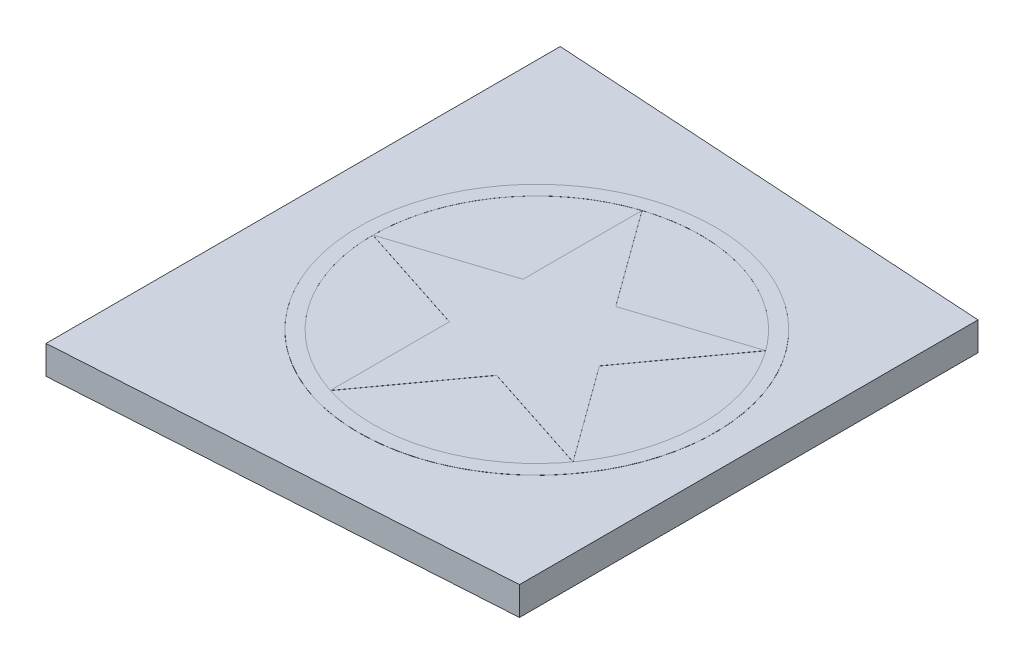
ISO-10303-21;
HEADER;
FILE_DESCRIPTION(('STEP AP214'),'2;1');
FILE_NAME('part.step','',(''),(''),'','','');
FILE_SCHEMA(('AUTOMOTIVE_DESIGN { 1 0 10303 214 1 1 1 1 }'));
ENDSEC;
DATA;
#1=APPLICATION_CONTEXT('core data for automotive mechanical design processes');
#2=APPLICATION_PROTOCOL_DEFINITION('international standard','automotive_design',2000,#1);
#3=PRODUCT_CONTEXT('',#1,'mechanical');
#4=PRODUCT('Part','Part','',(#3));
#5=PRODUCT_RELATED_PRODUCT_CATEGORY('part','',(#4));
#6=PRODUCT_DEFINITION_FORMATION('','',#4);
#7=PRODUCT_DEFINITION_CONTEXT('part definition',#1,'design');
#8=PRODUCT_DEFINITION('design','',#6,#7);
#9=PRODUCT_DEFINITION_SHAPE('','',#8);
#10=(LENGTH_UNIT() NAMED_UNIT(*) SI_UNIT(.MILLI.,.METRE.));
#11=(NAMED_UNIT(*) PLANE_ANGLE_UNIT() SI_UNIT($,.RADIAN.));
#12=(NAMED_UNIT(*) SI_UNIT($,.STERADIAN.) SOLID_ANGLE_UNIT());
#13=UNCERTAINTY_MEASURE_WITH_UNIT(LENGTH_MEASURE(1.E-05),#10,'distance_accuracy_value','');
#14=(GEOMETRIC_REPRESENTATION_CONTEXT(3) GLOBAL_UNCERTAINTY_ASSIGNED_CONTEXT((#13)) GLOBAL_UNIT_ASSIGNED_CONTEXT((#10,
#11,#12)) REPRESENTATION_CONTEXT('',''));
#15=CARTESIAN_POINT('',(0.,0.,0.));
#16=DIRECTION('',(0.,0.,1.));
#17=DIRECTION('',(1.,0.,0.));
#18=AXIS2_PLACEMENT_3D('',#15,#16,#17);
#19=CARTESIAN_POINT('',(0.,10.,0.));
#20=DIRECTION('',(0.,-1.,0.));
#21=DIRECTION('',(0.,0.,-1.));
#22=AXIS2_PLACEMENT_3D('',#19,#20,#21);
#23=PLANE('',#22);
#24=CARTESIAN_POINT('',(-98.922950819672,10.,-41.4078688524593));
#25=DIRECTION('',(0.,-1.,0.));
#26=DIRECTION('',(0.,0.,-1.));
#27=AXIS2_PLACEMENT_3D('',#24,#25,#26);
#28=CIRCLE('',#27,62.5);
#29=CARTESIAN_POINT('',(-98.922950819672,10.,-103.907868852459));
#30=VERTEX_POINT('',#29);
#31=EDGE_CURVE('E12',#30,#30,#28,.F.);
#32=ORIENTED_EDGE('',*,*,#31,.F.);
#33=EDGE_LOOP('',(#32));
#34=FACE_BOUND('',#33,.T.);
#35=DIRECTION('',(-0.998048585650659,0.,-0.0624421386622872));
#36=VECTOR('',#35,1.);
#37=CARTESIAN_POINT('',(-180.912950819672,10.,-131.617868852459));
#38=LINE('',#37,#36);
#39=CARTESIAN_POINT('',(-24.572950819672,10.,-121.836577541778));
#40=VERTEX_POINT('',#39);
#41=CARTESIAN_POINT('',(-180.912950819672,10.,-131.617868852459));
#42=VERTEX_POINT('',#41);
#43=EDGE_CURVE('E207',#40,#42,#38,.T.);
#44=ORIENTED_EDGE('',*,*,#43,.T.);
#45=DIRECTION('',(0.,0.,1.));
#46=VECTOR('',#45,1.);
#47=CARTESIAN_POINT('',(-180.912950819672,10.,-131.617868852459));
#48=LINE('',#47,#46);
#49=CARTESIAN_POINT('',(-180.912950819672,10.,48.802131147541));
#50=VERTEX_POINT('',#49);
#51=EDGE_CURVE('E210',#42,#50,#48,.T.);
#52=ORIENTED_EDGE('',*,*,#51,.T.);
#53=DIRECTION('',(0.998048585650658,0.,-0.0624421386622949));
#54=VECTOR('',#53,1.);
#55=CARTESIAN_POINT('',(-180.912950819672,10.,48.802131147541));
#56=LINE('',#55,#54);
#57=CARTESIAN_POINT('',(-24.572950819672,10.,39.0208398368591));
#58=VERTEX_POINT('',#57);
#59=EDGE_CURVE('E213',#50,#58,#56,.T.);
#60=ORIENTED_EDGE('',*,*,#59,.T.);
#61=DIRECTION('',(0.,0.,-1.));
#62=VECTOR('',#61,1.);
#63=CARTESIAN_POINT('',(-24.572950819672,10.,-121.836577541778));
#64=LINE('',#63,#62);
#65=EDGE_CURVE('E215',#58,#40,#64,.T.);
#66=ORIENTED_EDGE('',*,*,#65,.T.);
#67=EDGE_LOOP('',(#44,#52,#60,#66));
#68=FACE_BOUND('',#67,.T.);
#69=ADVANCED_FACE('F73',(#34,#68),#23,.F.);
#70=CARTESIAN_POINT('',(-180.912950819672,10.,-131.617868852459));
#71=DIRECTION('',(-0.0624421386622872,0.,0.998048585650658));
#72=DIRECTION('',(0.998048585650658,0.,0.0624421386622872));
#73=AXIS2_PLACEMENT_3D('',#70,#71,#72);
#74=PLANE('',#73);
#75=CARTESIAN_POINT('',(-173.926610720117,4.88,-131.180773881823));
#76=DIRECTION('',(0.0624421386622873,0.,-0.998048585650658));
#77=DIRECTION('',(-0.998048585650658,0.,-0.0624421386622873));
#78=AXIS2_PLACEMENT_3D('',#75,#76,#77);
#79=CIRCLE('',#78,4.62000000000002);
#80=CARTESIAN_POINT('',(-178.537595185823,4.88,-131.469256562443));
#81=VERTEX_POINT('',#80);
#82=EDGE_CURVE('E195',#81,#81,#79,.T.);
#83=ORIENTED_EDGE('',*,*,#82,.F.);
#84=EDGE_LOOP('',(#83));
#85=FACE_BOUND('',#84,.T.);
#86=DIRECTION('',(-0.998048585650659,0.,-0.0624421386622872));
#87=VECTOR('',#86,1.);
#88=CARTESIAN_POINT('',(-180.912950819672,0.,-131.617868852459));
#89=LINE('',#88,#87);
#90=CARTESIAN_POINT('',(-24.572950819672,0.,-121.836577541778));
#91=VERTEX_POINT('',#90);
#92=CARTESIAN_POINT('',(-180.912950819672,0.,-131.617868852459));
#93=VERTEX_POINT('',#92);
#94=EDGE_CURVE('E205',#91,#93,#89,.T.);
#95=ORIENTED_EDGE('',*,*,#94,.T.);
#96=DIRECTION('',(0.,-1.,0.));
#97=VECTOR('',#96,1.);
#98=CARTESIAN_POINT('',(-180.912950819672,10.,-131.617868852459));
#99=LINE('',#98,#97);
#100=EDGE_CURVE('E81',#42,#93,#99,.T.);
#101=ORIENTED_EDGE('',*,*,#100,.F.);
#102=ORIENTED_EDGE('',*,*,#43,.F.);
#103=DIRECTION('',(0.,-1.,0.));
#104=VECTOR('',#103,1.);
#105=CARTESIAN_POINT('',(-24.572950819672,10.,-121.836577541778));
#106=LINE('',#105,#104);
#107=EDGE_CURVE('E217',#40,#91,#106,.T.);
#108=ORIENTED_EDGE('',*,*,#107,.T.);
#109=EDGE_LOOP('',(#95,#101,#102,#108));
#110=FACE_BOUND('',#109,.T.);
#111=ADVANCED_FACE('F75',(#85,#110),#74,.F.);
#112=CARTESIAN_POINT('',(-180.912950819672,10.,-131.617868852459));
#113=DIRECTION('',(1.,0.,0.));
#114=DIRECTION('',(0.,0.,-1.));
#115=AXIS2_PLACEMENT_3D('',#112,#113,#114);
#116=PLANE('',#115);
#117=DIRECTION('',(0.,0.,1.));
#118=VECTOR('',#117,1.);
#119=CARTESIAN_POINT('',(-180.912950819672,0.,-131.617868852459));
#120=LINE('',#119,#118);
#121=CARTESIAN_POINT('',(-180.912950819672,0.,48.802131147541));
#122=VERTEX_POINT('',#121);
#123=EDGE_CURVE('E220',#93,#122,#120,.T.);
#124=ORIENTED_EDGE('',*,*,#123,.T.);
#125=DIRECTION('',(0.,-1.,0.));
#126=VECTOR('',#125,1.);
#127=CARTESIAN_POINT('',(-180.912950819672,10.,48.802131147541));
#128=LINE('',#127,#126);
#129=EDGE_CURVE('E230',#50,#122,#128,.T.);
#130=ORIENTED_EDGE('',*,*,#129,.F.);
#131=ORIENTED_EDGE('',*,*,#51,.F.);
#132=ORIENTED_EDGE('',*,*,#100,.T.);
#133=EDGE_LOOP('',(#124,#130,#131,#132));
#134=FACE_BOUND('',#133,.T.);
#135=ADVANCED_FACE('F235',(#134),#116,.F.);
#136=CARTESIAN_POINT('',(-180.912950819672,10.,48.802131147541));
#137=DIRECTION('',(-0.0624421386622949,0.,-0.998048585650658));
#138=DIRECTION('',(-0.998048585650658,0.,0.0624421386622949));
#139=AXIS2_PLACEMENT_3D('',#136,#137,#138);
#140=PLANE('',#139);
#141=DIRECTION('',(0.998048585650658,0.,-0.0624421386622949));
#142=VECTOR('',#141,1.);
#143=CARTESIAN_POINT('',(-180.912950819672,0.,48.802131147541));
#144=LINE('',#143,#142);
#145=CARTESIAN_POINT('',(-24.572950819672,0.,39.0208398368591));
#146=VERTEX_POINT('',#145);
#147=EDGE_CURVE('E222',#122,#146,#144,.T.);
#148=ORIENTED_EDGE('',*,*,#147,.T.);
#149=DIRECTION('',(0.,-1.,0.));
#150=VECTOR('',#149,1.);
#151=CARTESIAN_POINT('',(-24.572950819672,10.,39.0208398368591));
#152=LINE('',#151,#150);
#153=EDGE_CURVE('E227',#58,#146,#152,.T.);
#154=ORIENTED_EDGE('',*,*,#153,.F.);
#155=ORIENTED_EDGE('',*,*,#59,.F.);
#156=ORIENTED_EDGE('',*,*,#129,.T.);
#157=EDGE_LOOP('',(#148,#154,#155,#156));
#158=FACE_BOUND('',#157,.T.);
#159=ADVANCED_FACE('F247',(#158),#140,.F.);
#160=CARTESIAN_POINT('',(-24.572950819672,10.,-121.836577541778));
#161=DIRECTION('',(-1.,0.,0.));
#162=DIRECTION('',(0.,0.,1.));
#163=AXIS2_PLACEMENT_3D('',#160,#161,#162);
#164=PLANE('',#163);
#165=DIRECTION('',(0.,0.,-1.));
#166=VECTOR('',#165,1.);
#167=CARTESIAN_POINT('',(-24.572950819672,0.,-121.836577541778));
#168=LINE('',#167,#166);
#169=EDGE_CURVE('E211',#146,#91,#168,.T.);
#170=ORIENTED_EDGE('',*,*,#169,.T.);
#171=ORIENTED_EDGE('',*,*,#107,.F.);
#172=ORIENTED_EDGE('',*,*,#65,.F.);
#173=ORIENTED_EDGE('',*,*,#153,.T.);
#174=EDGE_LOOP('',(#170,#171,#172,#173));
#175=FACE_BOUND('',#174,.T.);
#176=ADVANCED_FACE('F251',(#175),#164,.F.);
#177=CARTESIAN_POINT('',(0.,0.,0.));
#178=DIRECTION('',(0.,-1.,0.));
#179=DIRECTION('',(0.,0.,-1.));
#180=AXIS2_PLACEMENT_3D('',#177,#178,#179);
#181=PLANE('',#180);
#182=ORIENTED_EDGE('',*,*,#94,.F.);
#183=ORIENTED_EDGE('',*,*,#169,.F.);
#184=ORIENTED_EDGE('',*,*,#147,.F.);
#185=ORIENTED_EDGE('',*,*,#123,.F.);
#186=EDGE_LOOP('',(#182,#183,#184,#185));
#187=FACE_BOUND('',#186,.T.);
#188=ADVANCED_FACE('F243',(#187),#181,.T.);
#189=CARTESIAN_POINT('',(-174.301263552091,4.88,-125.192482367919));
#190=DIRECTION('',(0.0624421386622873,0.,-0.998048585650658));
#191=DIRECTION('',(-0.998048585650659,0.,-0.0624421386622873));
#192=AXIS2_PLACEMENT_3D('',#189,#190,#191);
#193=CYLINDRICAL_SURFACE('',#192,4.62000000000002);
#194=CARTESIAN_POINT('',(-174.301263552091,4.88,-125.192482367919));
#195=DIRECTION('',(0.0624421386622873,0.,-0.998048585650658));
#196=DIRECTION('',(-0.998048585650658,0.,-0.0624421386622873));
#197=AXIS2_PLACEMENT_3D('',#194,#195,#196);
#198=CIRCLE('',#197,4.62000000000002);
#199=CARTESIAN_POINT('',(-178.912248017797,4.88,-125.480965048539));
#200=VERTEX_POINT('',#199);
#201=EDGE_CURVE('E198',#200,#200,#198,.T.);
#202=ORIENTED_EDGE('',*,*,#201,.F.);
#203=EDGE_LOOP('',(#202));
#204=FACE_BOUND('',#203,.T.);
#205=ORIENTED_EDGE('',*,*,#82,.T.);
#206=EDGE_LOOP('',(#205));
#207=FACE_BOUND('',#206,.T.);
#208=ADVANCED_FACE('F393',(#204,#207),#193,.F.);
#209=CARTESIAN_POINT('',(-174.301263552091,4.88,-125.192482367919));
#210=DIRECTION('',(0.0624421386622873,0.,-0.998048585650658));
#211=DIRECTION('',(-0.998048585650658,0.,-0.0624421386622873));
#212=AXIS2_PLACEMENT_3D('',#209,#210,#211);
#213=PLANE('',#212);
#214=ORIENTED_EDGE('',*,*,#201,.T.);
#215=EDGE_LOOP('',(#214));
#216=FACE_BOUND('',#215,.T.);
#217=ADVANCED_FACE('F390',(#216),#213,.T.);
#218=CARTESIAN_POINT('',(-98.922950819672,10.05,-41.4078688524593));
#219=DIRECTION('',(0.,-1.,0.));
#220=DIRECTION('',(0.,0.,-1.));
#221=AXIS2_PLACEMENT_3D('',#218,#219,#220);
#222=CYLINDRICAL_SURFACE('',#221,57.5);
#223=CARTESIAN_POINT('',(-98.922950819672,10.05,-41.4078688524593));
#224=DIRECTION('',(0.,1.,0.));
#225=DIRECTION('',(0.,0.,1.));
#226=AXIS2_PLACEMENT_3D('',#223,#224,#225);
#227=CIRCLE('',#226,57.5);
#228=CARTESIAN_POINT('',(-98.922950819672,10.05,16.0921311475407));
#229=VERTEX_POINT('',#228);
#230=EDGE_CURVE('E276',#229,#229,#227,.T.);
#231=ORIENTED_EDGE('',*,*,#230,.T.);
#232=EDGE_LOOP('',(#231));
#233=FACE_BOUND('',#232,.T.);
#234=CARTESIAN_POINT('',(-98.922950819672,10.,-41.4078688524593));
#235=DIRECTION('',(0.,1.,0.));
#236=DIRECTION('',(0.,0.,1.));
#237=AXIS2_PLACEMENT_3D('',#234,#235,#236);
#238=CIRCLE('',#237,57.5);
#239=CARTESIAN_POINT('',(-98.922950819672,10.,16.0921311475407));
#240=VERTEX_POINT('',#239);
#241=EDGE_CURVE('E274',#240,#240,#238,.T.);
#242=ORIENTED_EDGE('',*,*,#241,.F.);
#243=EDGE_LOOP('',(#242));
#244=FACE_BOUND('',#243,.T.);
#245=ADVANCED_FACE('F392',(#233,#244),#222,.F.);
#246=CARTESIAN_POINT('',(-98.922950819672,10.05,-41.4078688524593));
#247=DIRECTION('',(0.,-1.,0.));
#248=DIRECTION('',(0.,0.,-1.));
#249=AXIS2_PLACEMENT_3D('',#246,#247,#248);
#250=CYLINDRICAL_SURFACE('',#249,62.5);
#251=CARTESIAN_POINT('',(-98.922950819672,10.05,-41.4078688524593));
#252=DIRECTION('',(0.,1.,0.));
#253=DIRECTION('',(0.,0.,1.));
#254=AXIS2_PLACEMENT_3D('',#251,#252,#253);
#255=CIRCLE('',#254,62.5);
#256=CARTESIAN_POINT('',(-98.922950819672,10.05,21.0921311475407));
#257=VERTEX_POINT('',#256);
#258=EDGE_CURVE('E279',#257,#257,#255,.T.);
#259=ORIENTED_EDGE('',*,*,#258,.F.);
#260=EDGE_LOOP('',(#259));
#261=FACE_BOUND('',#260,.T.);
#262=ORIENTED_EDGE('',*,*,#31,.T.);
#263=EDGE_LOOP('',(#262));
#264=FACE_BOUND('',#263,.T.);
#265=ADVANCED_FACE('F457',(#261,#264),#250,.T.);
#266=CARTESIAN_POINT('',(0.,10.05,0.));
#267=DIRECTION('',(0.,1.,0.));
#268=DIRECTION('',(0.,0.,1.));
#269=AXIS2_PLACEMENT_3D('',#266,#267,#268);
#270=PLANE('',#269);
#271=ORIENTED_EDGE('',*,*,#230,.F.);
#272=EDGE_LOOP('',(#271));
#273=FACE_BOUND('',#272,.T.);
#274=ORIENTED_EDGE('',*,*,#258,.T.);
#275=EDGE_LOOP('',(#274));
#276=FACE_BOUND('',#275,.T.);
#277=ADVANCED_FACE('F466',(#273,#276),#270,.T.);
#278=CARTESIAN_POINT('',(0.,10.05,0.));
#279=DIRECTION('',(0.,1.,0.));
#280=DIRECTION('',(0.,0.,1.));
#281=AXIS2_PLACEMENT_3D('',#278,#279,#280);
#282=PLANE('',#281);
#283=DIRECTION('',(-0.951087706928488,0.,0.308920982986767));
#284=VECTOR('',#283,1.);
#285=CARTESIAN_POINT('',(-27.0938674752194,10.05,-83.4150015958435));
#286=LINE('',#285,#284);
#287=CARTESIAN_POINT('',(-116.685907341411,10.05,-54.3147821085837));
#288=VERTEX_POINT('',#287);
#289=CARTESIAN_POINT('',(-156.414016678165,10.05,-41.4107707339121));
#290=VERTEX_POINT('',#289);
#291=EDGE_CURVE('E182',#288,#290,#286,.T.);
#292=ORIENTED_EDGE('',*,*,#291,.T.);
#293=DIRECTION('',(0.95105651629515,0.,0.309016994374958));
#294=VECTOR('',#293,1.);
#295=CARTESIAN_POINT('',(-2.76588935181298,10.05,8.51253212372283));
#296=LINE('',#295,#294);
#297=CARTESIAN_POINT('',(-116.687210212726,10.05,-28.5027488448577));
#298=VERTEX_POINT('',#297);
#299=EDGE_CURVE('E171',#290,#298,#296,.T.);
#300=ORIENTED_EDGE('',*,*,#299,.T.);
#301=DIRECTION('',(-0.000100950692144524,0.,0.999999994904479));
#302=VECTOR('',#301,1.);
#303=CARTESIAN_POINT('',(-116.690086395771,10.05,-0.0117799450480823));
#304=LINE('',#303,#302);
#305=CARTESIAN_POINT('',(-116.691427047941,10.05,13.2684872303302));
#306=VERTEX_POINT('',#305);
#307=EDGE_CURVE('E181',#298,#306,#304,.T.);
#308=ORIENTED_EDGE('',*,*,#307,.T.);
#309=DIRECTION('',(0.58778525229248,0.,-0.809016994374943));
#310=VECTOR('',#309,1.);
#311=CARTESIAN_POINT('',(-70.0659899309161,10.05,-50.9059214516068));
#312=LINE('',#311,#310);
#313=CARTESIAN_POINT('',(-92.1389103878091,10.05,-20.5251528027413));
#314=VERTEX_POINT('',#313);
#315=EDGE_CURVE('E284',#306,#314,#312,.T.);
#316=ORIENTED_EDGE('',*,*,#315,.T.);
#317=DIRECTION('',(0.951025315969559,0.,0.309113002613932));
#318=VECTOR('',#317,1.);
#319=CARTESIAN_POINT('',(-2.77008381435774,10.05,8.52251381383011));
#320=LINE('',#319,#318);
#321=CARTESIAN_POINT('',(-52.4134071985422,10.05,-7.61312053085104));
#322=VERTEX_POINT('',#321);
#323=EDGE_CURVE('E286',#314,#322,#320,.T.);
#324=ORIENTED_EDGE('',*,*,#323,.T.);
#325=DIRECTION('',(-0.587785252292469,0.,-0.809016994374951));
#326=VECTOR('',#325,1.);
#327=CARTESIAN_POINT('',(-30.6847664328901,10.05,22.2937877754058));
#328=LINE('',#327,#326);
#329=CARTESIAN_POINT('',(-76.9659238586733,10.05,-41.4067605639231));
#330=VERTEX_POINT('',#329);
#331=EDGE_CURVE('E288',#322,#330,#328,.T.);
#332=ORIENTED_EDGE('',*,*,#331,.T.);
#333=DIRECTION('',(0.587866920122935,0.,-0.808957652924537));
#334=VECTOR('',#333,1.);
#335=CARTESIAN_POINT('',(-70.0588374619534,10.05,-50.9115314717145));
#336=LINE('',#335,#334);
#337=CARTESIAN_POINT('',(-52.4099958322992,10.05,-75.1979218312474));
#338=VERTEX_POINT('',#337);
#339=EDGE_CURVE('E290',#330,#338,#336,.T.);
#340=ORIENTED_EDGE('',*,*,#339,.T.);
#341=DIRECTION('',(-0.951056516295154,0.,0.309016994374946));
#342=VECTOR('',#341,1.);
#343=CARTESIAN_POINT('',(-27.104823992149,10.05,-83.4200705786704));
#344=LINE('',#343,#342);
#345=CARTESIAN_POINT('',(-92.1368022977395,10.05,-62.2898999421932));
#346=VERTEX_POINT('',#345);
#347=EDGE_CURVE('E292',#338,#346,#344,.T.);
#348=ORIENTED_EDGE('',*,*,#347,.T.);
#349=DIRECTION('',(-0.587703578471869,0.,-0.809076327580631));
#350=VECTOR('',#349,1.);
#351=CARTESIAN_POINT('',(-30.6945019018789,10.05,22.2961270676259));
#352=LINE('',#351,#350);
#353=CARTESIAN_POINT('',(-116.685907341411,10.05,-96.0860183966186));
#354=VERTEX_POINT('',#353);
#355=EDGE_CURVE('E294',#346,#354,#352,.T.);
#356=ORIENTED_EDGE('',*,*,#355,.T.);
#357=DIRECTION('',(0.,0.,1.));
#358=VECTOR('',#357,1.);
#359=CARTESIAN_POINT('',(-116.685907341411,10.05,0.));
#360=LINE('',#359,#358);
#361=EDGE_CURVE('E187',#354,#288,#360,.T.);
#362=ORIENTED_EDGE('',*,*,#361,.T.);
#363=EDGE_LOOP('',(#292,#300,#308,#316,#324,#332,#340,#348,#356,#362));
#364=FACE_BOUND('',#363,.T.);
#365=ADVANCED_FACE('F185',(#364),#282,.T.);
#366=CARTESIAN_POINT('',(-2.76588935181298,10.05,8.51253212372283));
#367=DIRECTION('',(0.309016994374958,0.,-0.95105651629515));
#368=DIRECTION('',(-0.95105651629515,0.,-0.309016994374958));
#369=AXIS2_PLACEMENT_3D('',#366,#367,#368);
#370=PLANE('',#369);
#371=DIRECTION('',(0.95105651629515,0.,0.309016994374958));
#372=VECTOR('',#371,1.);
#373=CARTESIAN_POINT('',(-2.76588935181298,10.,8.51253212372283));
#374=LINE('',#373,#372);
#375=CARTESIAN_POINT('',(-156.414016678164,10.,-41.4107707339121));
#376=VERTEX_POINT('',#375);
#377=CARTESIAN_POINT('',(-116.687210212726,10.,-28.5027488448577));
#378=VERTEX_POINT('',#377);
#379=EDGE_CURVE('E88',#376,#378,#374,.T.);
#380=ORIENTED_EDGE('',*,*,#379,.T.);
#381=DIRECTION('',(0.,-1.,0.));
#382=VECTOR('',#381,1.);
#383=CARTESIAN_POINT('',(-116.687210212726,10.05,-28.5027488448577));
#384=LINE('',#383,#382);
#385=EDGE_CURVE('E178',#298,#378,#384,.T.);
#386=ORIENTED_EDGE('',*,*,#385,.F.);
#387=ORIENTED_EDGE('',*,*,#299,.F.);
#388=DIRECTION('',(0.,-1.,0.));
#389=VECTOR('',#388,1.);
#390=CARTESIAN_POINT('',(-156.414016678165,10.05,-41.4107707339121));
#391=LINE('',#390,#389);
#392=EDGE_CURVE('E175',#290,#376,#391,.T.);
#393=ORIENTED_EDGE('',*,*,#392,.T.);
#394=EDGE_LOOP('',(#380,#386,#387,#393));
#395=FACE_BOUND('',#394,.T.);
#396=ADVANCED_FACE('F173',(#395),#370,.F.);
#397=CARTESIAN_POINT('',(-116.690086395771,10.05,-0.0117799450480823));
#398=DIRECTION('',(0.999999994904479,0.,0.000100950692144524));
#399=DIRECTION('',(0.000100950692144524,0.,-0.999999994904479));
#400=AXIS2_PLACEMENT_3D('',#397,#398,#399);
#401=PLANE('',#400);
#402=DIRECTION('',(-0.000100950692144524,0.,0.999999994904479));
#403=VECTOR('',#402,1.);
#404=CARTESIAN_POINT('',(-116.690086395771,10.,-0.0117799450480823));
#405=LINE('',#404,#403);
#406=CARTESIAN_POINT('',(-116.691427047941,10.,13.2684872303302));
#407=VERTEX_POINT('',#406);
#408=EDGE_CURVE('E93',#378,#407,#405,.T.);
#409=ORIENTED_EDGE('',*,*,#408,.T.);
#410=DIRECTION('',(0.,-1.,0.));
#411=VECTOR('',#410,1.);
#412=CARTESIAN_POINT('',(-116.691427047941,10.05,13.2684872303302));
#413=LINE('',#412,#411);
#414=EDGE_CURVE('E200',#306,#407,#413,.T.);
#415=ORIENTED_EDGE('',*,*,#414,.F.);
#416=ORIENTED_EDGE('',*,*,#307,.F.);
#417=ORIENTED_EDGE('',*,*,#385,.T.);
#418=EDGE_LOOP('',(#409,#415,#416,#417));
#419=FACE_BOUND('',#418,.T.);
#420=ADVANCED_FACE('F345',(#419),#401,.F.);
#421=CARTESIAN_POINT('',(-70.0659899309161,10.05,-50.9059214516068));
#422=DIRECTION('',(-0.809016994374943,0.,-0.58778525229248));
#423=DIRECTION('',(-0.58778525229248,0.,0.809016994374943));
#424=AXIS2_PLACEMENT_3D('',#421,#422,#423);
#425=PLANE('',#424);
#426=DIRECTION('',(0.58778525229248,0.,-0.809016994374943));
#427=VECTOR('',#426,1.);
#428=CARTESIAN_POINT('',(-70.0659899309161,10.,-50.9059214516068));
#429=LINE('',#428,#427);
#430=CARTESIAN_POINT('',(-92.1389103878091,10.,-20.5251528027413));
#431=VERTEX_POINT('',#430);
#432=EDGE_CURVE('E301',#407,#431,#429,.T.);
#433=ORIENTED_EDGE('',*,*,#432,.T.);
#434=DIRECTION('',(0.,-1.,0.));
#435=VECTOR('',#434,1.);
#436=CARTESIAN_POINT('',(-92.1389103878091,10.05,-20.5251528027413));
#437=LINE('',#436,#435);
#438=EDGE_CURVE('E336',#314,#431,#437,.T.);
#439=ORIENTED_EDGE('',*,*,#438,.F.);
#440=ORIENTED_EDGE('',*,*,#315,.F.);
#441=ORIENTED_EDGE('',*,*,#414,.T.);
#442=EDGE_LOOP('',(#433,#439,#440,#441));
#443=FACE_BOUND('',#442,.T.);
#444=ADVANCED_FACE('F342',(#443),#425,.F.);
#445=CARTESIAN_POINT('',(-2.77008381435774,10.05,8.52251381383011));
#446=DIRECTION('',(0.309113002613932,0.,-0.951025315969559));
#447=DIRECTION('',(-0.951025315969559,0.,-0.309113002613932));
#448=AXIS2_PLACEMENT_3D('',#445,#446,#447);
#449=PLANE('',#448);
#450=DIRECTION('',(0.951025315969559,0.,0.309113002613932));
#451=VECTOR('',#450,1.);
#452=CARTESIAN_POINT('',(-2.77008381435774,10.,8.52251381383011));
#453=LINE('',#452,#451);
#454=CARTESIAN_POINT('',(-52.4134071985422,10.,-7.61312053085105));
#455=VERTEX_POINT('',#454);
#456=EDGE_CURVE('E304',#431,#455,#453,.T.);
#457=ORIENTED_EDGE('',*,*,#456,.T.);
#458=DIRECTION('',(0.,-1.,0.));
#459=VECTOR('',#458,1.);
#460=CARTESIAN_POINT('',(-52.4134071985422,10.05,-7.61312053085104));
#461=LINE('',#460,#459);
#462=EDGE_CURVE('E333',#322,#455,#461,.T.);
#463=ORIENTED_EDGE('',*,*,#462,.F.);
#464=ORIENTED_EDGE('',*,*,#323,.F.);
#465=ORIENTED_EDGE('',*,*,#438,.T.);
#466=EDGE_LOOP('',(#457,#463,#464,#465));
#467=FACE_BOUND('',#466,.T.);
#468=ADVANCED_FACE('F349',(#467),#449,.F.);
#469=CARTESIAN_POINT('',(-30.6847664328901,10.05,22.2937877754058));
#470=DIRECTION('',(-0.809016994374951,0.,0.587785252292469));
#471=DIRECTION('',(0.587785252292469,0.,0.809016994374951));
#472=AXIS2_PLACEMENT_3D('',#469,#470,#471);
#473=PLANE('',#472);
#474=DIRECTION('',(-0.587785252292469,0.,-0.809016994374951));
#475=VECTOR('',#474,1.);
#476=CARTESIAN_POINT('',(-30.6847664328901,10.,22.2937877754058));
#477=LINE('',#476,#475);
#478=CARTESIAN_POINT('',(-76.9659238586732,10.,-41.4067605639231));
#479=VERTEX_POINT('',#478);
#480=EDGE_CURVE('E307',#455,#479,#477,.T.);
#481=ORIENTED_EDGE('',*,*,#480,.T.);
#482=DIRECTION('',(0.,-1.,0.));
#483=VECTOR('',#482,1.);
#484=CARTESIAN_POINT('',(-76.9659238586733,10.05,-41.4067605639231));
#485=LINE('',#484,#483);
#486=EDGE_CURVE('E330',#330,#479,#485,.T.);
#487=ORIENTED_EDGE('',*,*,#486,.F.);
#488=ORIENTED_EDGE('',*,*,#331,.F.);
#489=ORIENTED_EDGE('',*,*,#462,.T.);
#490=EDGE_LOOP('',(#481,#487,#488,#489));
#491=FACE_BOUND('',#490,.T.);
#492=ADVANCED_FACE('F353',(#491),#473,.F.);
#493=CARTESIAN_POINT('',(-70.0588374619534,10.05,-50.9115314717145));
#494=DIRECTION('',(-0.808957652924537,0.,-0.587866920122935));
#495=DIRECTION('',(-0.587866920122935,0.,0.808957652924537));
#496=AXIS2_PLACEMENT_3D('',#493,#494,#495);
#497=PLANE('',#496);
#498=DIRECTION('',(0.587866920122935,0.,-0.808957652924537));
#499=VECTOR('',#498,1.);
#500=CARTESIAN_POINT('',(-70.0588374619534,10.,-50.9115314717145));
#501=LINE('',#500,#499);
#502=CARTESIAN_POINT('',(-52.4099958322992,10.,-75.1979218312474));
#503=VERTEX_POINT('',#502);
#504=EDGE_CURVE('E310',#479,#503,#501,.T.);
#505=ORIENTED_EDGE('',*,*,#504,.T.);
#506=DIRECTION('',(0.,-1.,0.));
#507=VECTOR('',#506,1.);
#508=CARTESIAN_POINT('',(-52.4099958322992,10.05,-75.1979218312474));
#509=LINE('',#508,#507);
#510=EDGE_CURVE('E327',#338,#503,#509,.T.);
#511=ORIENTED_EDGE('',*,*,#510,.F.);
#512=ORIENTED_EDGE('',*,*,#339,.F.);
#513=ORIENTED_EDGE('',*,*,#486,.T.);
#514=EDGE_LOOP('',(#505,#511,#512,#513));
#515=FACE_BOUND('',#514,.T.);
#516=ADVANCED_FACE('F359',(#515),#497,.F.);
#517=CARTESIAN_POINT('',(-27.104823992149,10.05,-83.4200705786704));
#518=DIRECTION('',(0.309016994374946,0.,0.951056516295154));
#519=DIRECTION('',(0.951056516295154,0.,-0.309016994374946));
#520=AXIS2_PLACEMENT_3D('',#517,#518,#519);
#521=PLANE('',#520);
#522=DIRECTION('',(-0.951056516295154,0.,0.309016994374946));
#523=VECTOR('',#522,1.);
#524=CARTESIAN_POINT('',(-27.104823992149,10.,-83.4200705786704));
#525=LINE('',#524,#523);
#526=CARTESIAN_POINT('',(-92.1368022977395,10.,-62.2898999421932));
#527=VERTEX_POINT('',#526);
#528=EDGE_CURVE('E313',#503,#527,#525,.T.);
#529=ORIENTED_EDGE('',*,*,#528,.T.);
#530=DIRECTION('',(0.,-1.,0.));
#531=VECTOR('',#530,1.);
#532=CARTESIAN_POINT('',(-92.1368022977395,10.05,-62.2898999421932));
#533=LINE('',#532,#531);
#534=EDGE_CURVE('E324',#346,#527,#533,.T.);
#535=ORIENTED_EDGE('',*,*,#534,.F.);
#536=ORIENTED_EDGE('',*,*,#347,.F.);
#537=ORIENTED_EDGE('',*,*,#510,.T.);
#538=EDGE_LOOP('',(#529,#535,#536,#537));
#539=FACE_BOUND('',#538,.T.);
#540=ADVANCED_FACE('F361',(#539),#521,.F.);
#541=CARTESIAN_POINT('',(-30.6945019018789,10.05,22.2961270676259));
#542=DIRECTION('',(-0.809076327580631,0.,0.587703578471869));
#543=DIRECTION('',(0.587703578471869,0.,0.809076327580631));
#544=AXIS2_PLACEMENT_3D('',#541,#542,#543);
#545=PLANE('',#544);
#546=DIRECTION('',(-0.587703578471869,0.,-0.809076327580631));
#547=VECTOR('',#546,1.);
#548=CARTESIAN_POINT('',(-30.6945019018789,10.,22.2961270676259));
#549=LINE('',#548,#547);
#550=CARTESIAN_POINT('',(-116.685907341411,10.,-96.0860183966186));
#551=VERTEX_POINT('',#550);
#552=EDGE_CURVE('E316',#527,#551,#549,.T.);
#553=ORIENTED_EDGE('',*,*,#552,.T.);
#554=DIRECTION('',(0.,-1.,0.));
#555=VECTOR('',#554,1.);
#556=CARTESIAN_POINT('',(-116.685907341411,10.05,-96.0860183966186));
#557=LINE('',#556,#555);
#558=EDGE_CURVE('E321',#354,#551,#557,.T.);
#559=ORIENTED_EDGE('',*,*,#558,.F.);
#560=ORIENTED_EDGE('',*,*,#355,.F.);
#561=ORIENTED_EDGE('',*,*,#534,.T.);
#562=EDGE_LOOP('',(#553,#559,#560,#561));
#563=FACE_BOUND('',#562,.T.);
#564=ADVANCED_FACE('F365',(#563),#545,.F.);
#565=CARTESIAN_POINT('',(-116.685907341411,10.05,0.));
#566=DIRECTION('',(1.,0.,0.));
#567=DIRECTION('',(0.,0.,-1.));
#568=AXIS2_PLACEMENT_3D('',#565,#566,#567);
#569=PLANE('',#568);
#570=DIRECTION('',(0.,0.,1.));
#571=VECTOR('',#570,1.);
#572=CARTESIAN_POINT('',(-116.685907341411,10.,0.));
#573=LINE('',#572,#571);
#574=CARTESIAN_POINT('',(-116.685907341411,10.,-54.3147821085837));
#575=VERTEX_POINT('',#574);
#576=EDGE_CURVE('E191',#551,#575,#573,.T.);
#577=ORIENTED_EDGE('',*,*,#576,.T.);
#578=DIRECTION('',(0.,-1.,0.));
#579=VECTOR('',#578,1.);
#580=CARTESIAN_POINT('',(-116.685907341411,10.05,-54.3147821085837));
#581=LINE('',#580,#579);
#582=EDGE_CURVE('E297',#288,#575,#581,.T.);
#583=ORIENTED_EDGE('',*,*,#582,.F.);
#584=ORIENTED_EDGE('',*,*,#361,.F.);
#585=ORIENTED_EDGE('',*,*,#558,.T.);
#586=EDGE_LOOP('',(#577,#583,#584,#585));
#587=FACE_BOUND('',#586,.T.);
#588=ADVANCED_FACE('F268',(#587),#569,.F.);
#589=CARTESIAN_POINT('',(-27.0938674752194,10.05,-83.4150015958435));
#590=DIRECTION('',(0.308920982986767,0.,0.951087706928488));
#591=DIRECTION('',(0.951087706928488,0.,-0.308920982986767));
#592=AXIS2_PLACEMENT_3D('',#589,#590,#591);
#593=PLANE('',#592);
#594=DIRECTION('',(-0.951087706928488,0.,0.308920982986767));
#595=VECTOR('',#594,1.);
#596=CARTESIAN_POINT('',(-27.0938674752194,10.,-83.4150015958435));
#597=LINE('',#596,#595);
#598=EDGE_CURVE('E194',#575,#376,#597,.T.);
#599=ORIENTED_EDGE('',*,*,#598,.T.);
#600=ORIENTED_EDGE('',*,*,#392,.F.);
#601=ORIENTED_EDGE('',*,*,#291,.F.);
#602=ORIENTED_EDGE('',*,*,#582,.T.);
#603=EDGE_LOOP('',(#599,#600,#601,#602));
#604=FACE_BOUND('',#603,.T.);
#605=ADVANCED_FACE('F193',(#604),#593,.F.);
#606=ORIENTED_EDGE('',*,*,#598,.F.);
#607=ORIENTED_EDGE('',*,*,#576,.F.);
#608=ORIENTED_EDGE('',*,*,#552,.F.);
#609=ORIENTED_EDGE('',*,*,#528,.F.);
#610=ORIENTED_EDGE('',*,*,#504,.F.);
#611=ORIENTED_EDGE('',*,*,#480,.F.);
#612=ORIENTED_EDGE('',*,*,#456,.F.);
#613=ORIENTED_EDGE('',*,*,#432,.F.);
#614=ORIENTED_EDGE('',*,*,#408,.F.);
#615=ORIENTED_EDGE('',*,*,#379,.F.);
#616=EDGE_LOOP('',(#606,#607,#608,#609,#610,#611,#612,#613,#614,#615));
#617=FACE_BOUND('',#616,.T.);
#618=ORIENTED_EDGE('',*,*,#241,.T.);
#619=EDGE_LOOP('',(#618));
#620=FACE_BOUND('',#619,.T.);
#621=ADVANCED_FACE('F256',(#617,#620),#23,.F.);
#622=CLOSED_SHELL('',(#69,#111,#135,#159,#176,#188,#208,#217,#245,#265,#277,#365,#396,#420,#444,
#468,#492,#516,#540,#564,#588,#605,#621));
#623=MANIFOLD_SOLID_BREP('B2',#622);
#624=ADVANCED_BREP_SHAPE_REPRESENTATION('',(#18,#623),#14);
#625=SHAPE_DEFINITION_REPRESENTATION(#9,#624);
ENDSEC;
END-ISO-10303-21;
